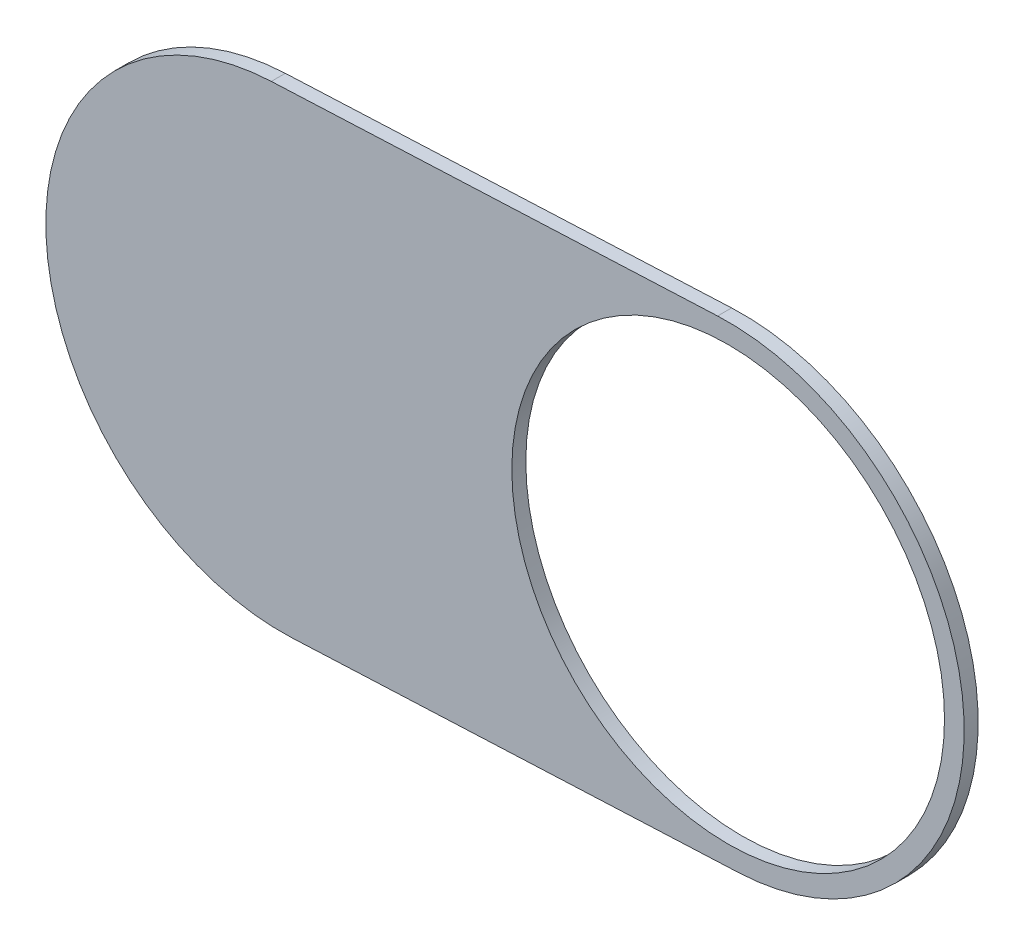
ISO-10303-21;
HEADER;
FILE_DESCRIPTION(('STEP AP214'),'2;1');
FILE_NAME('part.step','',(''),(''),'','','');
FILE_SCHEMA(('AUTOMOTIVE_DESIGN { 1 0 10303 214 1 1 1 1 }'));
ENDSEC;
DATA;
#1=APPLICATION_CONTEXT('core data for automotive mechanical design processes');
#2=APPLICATION_PROTOCOL_DEFINITION('international standard','automotive_design',2000,#1);
#3=PRODUCT_CONTEXT('',#1,'mechanical');
#4=PRODUCT('Part','Part','',(#3));
#5=PRODUCT_RELATED_PRODUCT_CATEGORY('part','',(#4));
#6=PRODUCT_DEFINITION_FORMATION('','',#4);
#7=PRODUCT_DEFINITION_CONTEXT('part definition',#1,'design');
#8=PRODUCT_DEFINITION('design','',#6,#7);
#9=PRODUCT_DEFINITION_SHAPE('','',#8);
#10=(LENGTH_UNIT() NAMED_UNIT(*) SI_UNIT(.MILLI.,.METRE.));
#11=(NAMED_UNIT(*) PLANE_ANGLE_UNIT() SI_UNIT($,.RADIAN.));
#12=(NAMED_UNIT(*) SI_UNIT($,.STERADIAN.) SOLID_ANGLE_UNIT());
#13=UNCERTAINTY_MEASURE_WITH_UNIT(LENGTH_MEASURE(1.E-05),#10,'distance_accuracy_value','');
#14=(GEOMETRIC_REPRESENTATION_CONTEXT(3) GLOBAL_UNCERTAINTY_ASSIGNED_CONTEXT((#13)) GLOBAL_UNIT_ASSIGNED_CONTEXT((#10,
#11,#12)) REPRESENTATION_CONTEXT('',''));
#15=CARTESIAN_POINT('',(0.,0.,0.));
#16=DIRECTION('',(0.,0.,1.));
#17=DIRECTION('',(1.,0.,0.));
#18=AXIS2_PLACEMENT_3D('',#15,#16,#17);
#19=CARTESIAN_POINT('',(84.6342351,56.63726544,0.));
#20=DIRECTION('',(-0.044727869784935,0.998999208039977,0.));
#21=DIRECTION('',(0.998999208039977,0.044727869784935,0.));
#22=AXIS2_PLACEMENT_3D('',#19,#20,#21);
#23=PLANE('',#22);
#24=DIRECTION('',(0.998999208039977,0.044727869784935,0.));
#25=VECTOR('',#24,1.);
#26=CARTESIAN_POINT('',(84.6342351,56.63726544,0.03556));
#27=LINE('',#26,#25);
#28=CARTESIAN_POINT('',(84.6342351,56.63726544,0.03556));
#29=VERTEX_POINT('',#28);
#30=CARTESIAN_POINT('',(85.76885564,56.68806544,0.03556));
#31=VERTEX_POINT('',#30);
#32=EDGE_CURVE('E11',#29,#31,#27,.T.);
#33=ORIENTED_EDGE('',*,*,#32,.F.);
#34=DIRECTION('',(0.,0.,1.));
#35=VECTOR('',#34,1.);
#36=CARTESIAN_POINT('',(84.6342351,56.63726544,0.));
#37=LINE('',#36,#35);
#38=CARTESIAN_POINT('',(84.6342351,56.63726544,0.));
#39=VERTEX_POINT('',#38);
#40=EDGE_CURVE('E24',#39,#29,#37,.T.);
#41=ORIENTED_EDGE('',*,*,#40,.F.);
#42=DIRECTION('',(0.998999208039977,0.044727869784935,0.));
#43=VECTOR('',#42,1.);
#44=CARTESIAN_POINT('',(84.6342351,56.63726544,0.));
#45=LINE('',#44,#43);
#46=CARTESIAN_POINT('',(85.76885564,56.68806544,0.));
#47=VERTEX_POINT('',#46);
#48=EDGE_CURVE('E96',#39,#47,#45,.T.);
#49=ORIENTED_EDGE('',*,*,#48,.T.);
#50=DIRECTION('',(0.,0.,1.));
#51=VECTOR('',#50,1.);
#52=CARTESIAN_POINT('',(85.76885564,56.68806544,0.));
#53=LINE('',#52,#51);
#54=EDGE_CURVE('E37',#47,#31,#53,.T.);
#55=ORIENTED_EDGE('',*,*,#54,.T.);
#56=EDGE_LOOP('',(#33,#41,#49,#55));
#57=FACE_BOUND('',#56,.T.);
#58=ADVANCED_FACE('F17',(#57),#23,.F.);
#59=CARTESIAN_POINT('',(84.6073999407123,57.2366648542061,0.));
#60=DIRECTION('',(0.,0.,-1.));
#61=DIRECTION('',(-0.0447293146354395,0.998999143349104,0.));
#62=AXIS2_PLACEMENT_3D('',#59,#60,#61);
#63=CYLINDRICAL_SURFACE('',#62,0.599999819603851);
#64=CARTESIAN_POINT('',(84.6073999407123,57.2366648542061,0.03556));
#65=DIRECTION('',(0.,0.,1.));
#66=DIRECTION('',(-0.0447293146354395,0.998999143349104,0.));
#67=AXIS2_PLACEMENT_3D('',#64,#65,#66);
#68=CIRCLE('',#67,0.599999819603851);
#69=CARTESIAN_POINT('',(84.58056236,57.83606416,0.03556));
#70=VERTEX_POINT('',#69);
#71=EDGE_CURVE('E92',#70,#29,#68,.T.);
#72=ORIENTED_EDGE('',*,*,#71,.F.);
#73=DIRECTION('',(0.,0.,1.));
#74=VECTOR('',#73,1.);
#75=CARTESIAN_POINT('',(84.58056236,57.83606416,0.));
#76=LINE('',#75,#74);
#77=CARTESIAN_POINT('',(84.58056236,57.83606416,0.));
#78=VERTEX_POINT('',#77);
#79=EDGE_CURVE('E90',#78,#70,#76,.T.);
#80=ORIENTED_EDGE('',*,*,#79,.F.);
#81=CARTESIAN_POINT('',(84.6073999407123,57.2366648542061,0.));
#82=DIRECTION('',(0.,0.,1.));
#83=DIRECTION('',(-0.0447293146354395,0.998999143349104,0.));
#84=AXIS2_PLACEMENT_3D('',#81,#82,#83);
#85=CIRCLE('',#84,0.599999819603851);
#86=EDGE_CURVE('E88',#78,#39,#85,.T.);
#87=ORIENTED_EDGE('',*,*,#86,.T.);
#88=ORIENTED_EDGE('',*,*,#40,.T.);
#89=EDGE_LOOP('',(#72,#80,#87,#88));
#90=FACE_BOUND('',#89,.T.);
#91=ADVANCED_FACE('F111',(#90),#63,.T.);
#92=CARTESIAN_POINT('',(85.7420180592877,57.2874647457939,0.));
#93=DIRECTION('',(0.,0.,-1.));
#94=DIRECTION('',(0.0447293146354401,-0.998999143349104,0.));
#95=AXIS2_PLACEMENT_3D('',#92,#93,#94);
#96=CYLINDRICAL_SURFACE('',#95,0.599999819603849);
#97=CARTESIAN_POINT('',(85.7420180592877,57.2874647457939,0.03556));
#98=DIRECTION('',(0.,0.,1.));
#99=DIRECTION('',(0.0447293146354401,-0.998999143349104,0.));
#100=AXIS2_PLACEMENT_3D('',#97,#98,#99);
#101=CIRCLE('',#100,0.599999819603849);
#102=CARTESIAN_POINT('',(85.7151829,57.88686416,0.03556));
#103=VERTEX_POINT('',#102);
#104=EDGE_CURVE('E85',#31,#103,#101,.T.);
#105=ORIENTED_EDGE('',*,*,#104,.F.);
#106=ORIENTED_EDGE('',*,*,#54,.F.);
#107=CARTESIAN_POINT('',(85.7420180592877,57.2874647457939,0.));
#108=DIRECTION('',(0.,0.,1.));
#109=DIRECTION('',(0.0447293146354401,-0.998999143349104,0.));
#110=AXIS2_PLACEMENT_3D('',#107,#108,#109);
#111=CIRCLE('',#110,0.599999819603849);
#112=CARTESIAN_POINT('',(85.7151829,57.88686416,0.));
#113=VERTEX_POINT('',#112);
#114=EDGE_CURVE('E82',#47,#113,#111,.T.);
#115=ORIENTED_EDGE('',*,*,#114,.T.);
#116=DIRECTION('',(0.,0.,1.));
#117=VECTOR('',#116,1.);
#118=CARTESIAN_POINT('',(85.7151829,57.88686416,0.));
#119=LINE('',#118,#117);
#120=EDGE_CURVE('E80',#113,#103,#119,.T.);
#121=ORIENTED_EDGE('',*,*,#120,.T.);
#122=EDGE_LOOP('',(#105,#106,#115,#121));
#123=FACE_BOUND('',#122,.T.);
#124=ADVANCED_FACE('F104',(#123),#96,.T.);
#125=CARTESIAN_POINT('',(85.7151829,57.88686416,0.));
#126=DIRECTION('',(0.0447278697849293,-0.998999208039978,0.));
#127=DIRECTION('',(-0.998999208039978,-0.0447278697849293,0.));
#128=AXIS2_PLACEMENT_3D('',#125,#126,#127);
#129=PLANE('',#128);
#130=DIRECTION('',(-0.998999208039978,-0.0447278697849293,0.));
#131=VECTOR('',#130,1.);
#132=CARTESIAN_POINT('',(85.7151829,57.88686416,0.03556));
#133=LINE('',#132,#131);
#134=EDGE_CURVE('E77',#103,#70,#133,.T.);
#135=ORIENTED_EDGE('',*,*,#134,.F.);
#136=ORIENTED_EDGE('',*,*,#120,.F.);
#137=DIRECTION('',(-0.998999208039978,-0.0447278697849293,0.));
#138=VECTOR('',#137,1.);
#139=CARTESIAN_POINT('',(85.7151829,57.88686416,0.));
#140=LINE('',#139,#138);
#141=EDGE_CURVE('E68',#113,#78,#140,.T.);
#142=ORIENTED_EDGE('',*,*,#141,.T.);
#143=ORIENTED_EDGE('',*,*,#79,.T.);
#144=EDGE_LOOP('',(#135,#136,#142,#143));
#145=FACE_BOUND('',#144,.T.);
#146=ADVANCED_FACE('F110',(#145),#129,.F.);
#147=CARTESIAN_POINT('',(85.742018,57.2874648,0.));
#148=DIRECTION('',(0.,0.,-1.));
#149=DIRECTION('',(1.,0.,0.));
#150=AXIS2_PLACEMENT_3D('',#147,#148,#149);
#151=CYLINDRICAL_SURFACE('',#150,0.5499989);
#152=DIRECTION('',(0.,0.,1.));
#153=VECTOR('',#152,1.);
#154=CARTESIAN_POINT('',(86.2920169,57.2874648,0.));
#155=LINE('',#154,#153);
#156=CARTESIAN_POINT('',(86.2920169,57.2874648,0.));
#157=VERTEX_POINT('',#156);
#158=CARTESIAN_POINT('',(86.2920169,57.2874648,0.03556));
#159=VERTEX_POINT('',#158);
#160=EDGE_CURVE('E62',#157,#159,#155,.T.);
#161=ORIENTED_EDGE('',*,*,#160,.T.);
#162=CARTESIAN_POINT('',(85.742018,57.2874648,0.03556));
#163=DIRECTION('',(0.,0.,1.));
#164=DIRECTION('',(1.,0.,0.));
#165=AXIS2_PLACEMENT_3D('',#162,#163,#164);
#166=CIRCLE('',#165,0.5499989);
#167=EDGE_CURVE('E67',#159,#159,#166,.T.);
#168=ORIENTED_EDGE('',*,*,#167,.T.);
#169=ORIENTED_EDGE('',*,*,#160,.F.);
#170=CARTESIAN_POINT('',(85.742018,57.2874648,0.));
#171=DIRECTION('',(0.,0.,1.));
#172=DIRECTION('',(1.,0.,0.));
#173=AXIS2_PLACEMENT_3D('',#170,#171,#172);
#174=CIRCLE('',#173,0.5499989);
#175=EDGE_CURVE('E65',#157,#157,#174,.T.);
#176=ORIENTED_EDGE('',*,*,#175,.F.);
#177=EDGE_LOOP('',(#161,#168,#169,#176));
#178=FACE_BOUND('',#177,.T.);
#179=ADVANCED_FACE('F64',(#178),#151,.F.);
#180=CARTESIAN_POINT('',(84.6342351,56.63726544,0.));
#181=DIRECTION('',(0.,0.,-1.));
#182=DIRECTION('',(-1.,0.,0.));
#183=AXIS2_PLACEMENT_3D('',#180,#181,#182);
#184=PLANE('',#183);
#185=ORIENTED_EDGE('',*,*,#48,.F.);
#186=ORIENTED_EDGE('',*,*,#86,.F.);
#187=ORIENTED_EDGE('',*,*,#141,.F.);
#188=ORIENTED_EDGE('',*,*,#114,.F.);
#189=EDGE_LOOP('',(#185,#186,#187,#188));
#190=FACE_BOUND('',#189,.T.);
#191=ORIENTED_EDGE('',*,*,#175,.T.);
#192=EDGE_LOOP('',(#191));
#193=FACE_BOUND('',#192,.T.);
#194=ADVANCED_FACE('F71',(#190,#193),#184,.T.);
#195=CARTESIAN_POINT('',(84.6342351,56.63726544,0.03556));
#196=DIRECTION('',(0.,0.,-1.));
#197=DIRECTION('',(-1.,0.,0.));
#198=AXIS2_PLACEMENT_3D('',#195,#196,#197);
#199=PLANE('',#198);
#200=ORIENTED_EDGE('',*,*,#134,.T.);
#201=ORIENTED_EDGE('',*,*,#71,.T.);
#202=ORIENTED_EDGE('',*,*,#32,.T.);
#203=ORIENTED_EDGE('',*,*,#104,.T.);
#204=EDGE_LOOP('',(#200,#201,#202,#203));
#205=FACE_BOUND('',#204,.T.);
#206=ORIENTED_EDGE('',*,*,#167,.F.);
#207=EDGE_LOOP('',(#206));
#208=FACE_BOUND('',#207,.T.);
#209=ADVANCED_FACE('F107',(#205,#208),#199,.F.);
#210=CLOSED_SHELL('',(#58,#91,#124,#146,#179,#194,#209));
#211=MANIFOLD_SOLID_BREP('B1',#210);
#212=ADVANCED_BREP_SHAPE_REPRESENTATION('',(#18,#211),#14);
#213=SHAPE_DEFINITION_REPRESENTATION(#9,#212);
ENDSEC;
END-ISO-10303-21;
